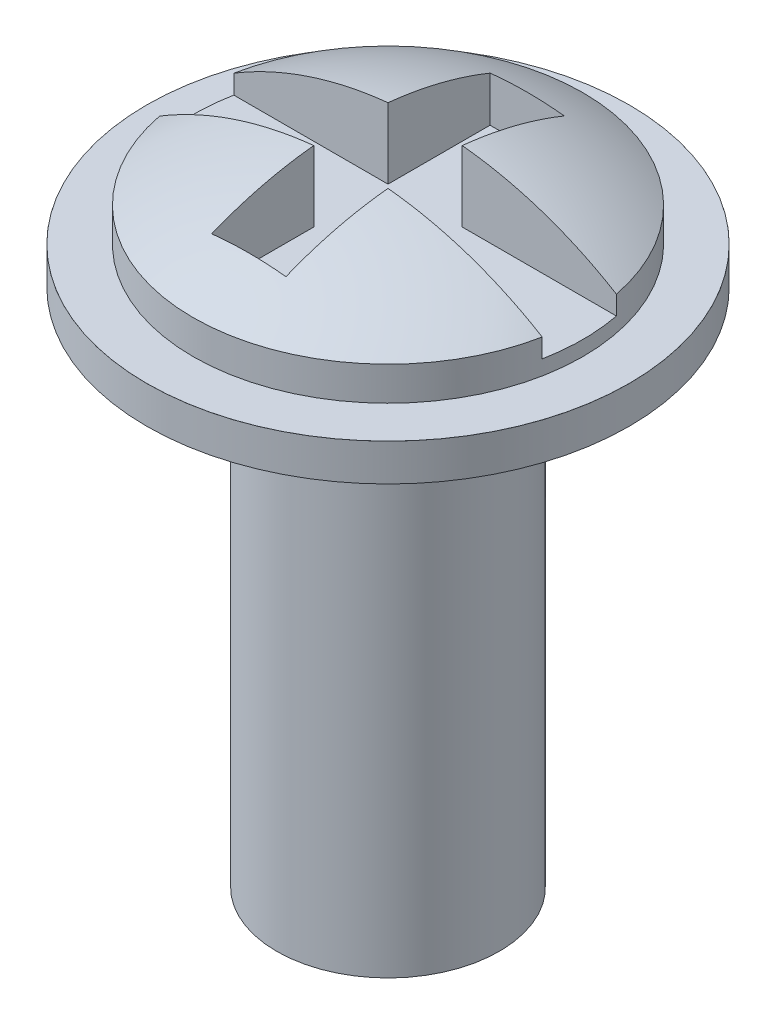
ISO-10303-21;
HEADER;
FILE_DESCRIPTION(('STEP AP214'),'2;1');
FILE_NAME('part.step','',(''),(''),'','','');
FILE_SCHEMA(('AUTOMOTIVE_DESIGN { 1 0 10303 214 1 1 1 1 }'));
ENDSEC;
DATA;
#1=APPLICATION_CONTEXT('core data for automotive mechanical design processes');
#2=APPLICATION_PROTOCOL_DEFINITION('international standard','automotive_design',2000,#1);
#3=PRODUCT_CONTEXT('',#1,'mechanical');
#4=PRODUCT('Part','Part','',(#3));
#5=PRODUCT_RELATED_PRODUCT_CATEGORY('part','',(#4));
#6=PRODUCT_DEFINITION_FORMATION('','',#4);
#7=PRODUCT_DEFINITION_CONTEXT('part definition',#1,'design');
#8=PRODUCT_DEFINITION('design','',#6,#7);
#9=PRODUCT_DEFINITION_SHAPE('','',#8);
#10=(LENGTH_UNIT() NAMED_UNIT(*) SI_UNIT(.MILLI.,.METRE.));
#11=(NAMED_UNIT(*) PLANE_ANGLE_UNIT() SI_UNIT($,.RADIAN.));
#12=(NAMED_UNIT(*) SI_UNIT($,.STERADIAN.) SOLID_ANGLE_UNIT());
#13=UNCERTAINTY_MEASURE_WITH_UNIT(LENGTH_MEASURE(1.E-05),#10,'distance_accuracy_value','');
#14=(GEOMETRIC_REPRESENTATION_CONTEXT(3) GLOBAL_UNCERTAINTY_ASSIGNED_CONTEXT((#13)) GLOBAL_UNIT_ASSIGNED_CONTEXT((#10,
#11,#12)) REPRESENTATION_CONTEXT('',''));
#15=CARTESIAN_POINT('',(0.,0.,0.));
#16=DIRECTION('',(0.,0.,1.));
#17=DIRECTION('',(1.,0.,0.));
#18=AXIS2_PLACEMENT_3D('',#15,#16,#17);
#19=CARTESIAN_POINT('',(0.,7.5,0.));
#20=DIRECTION('',(0.,-1.,0.));
#21=DIRECTION('',(0.,0.,-1.));
#22=AXIS2_PLACEMENT_3D('',#19,#20,#21);
#23=CYLINDRICAL_SURFACE('',#22,3.25);
#24=CARTESIAN_POINT('',(0.,7.,0.));
#25=DIRECTION('',(0.,1.,0.));
#26=DIRECTION('',(0.,0.,1.));
#27=AXIS2_PLACEMENT_3D('',#24,#25,#26);
#28=CIRCLE('',#27,3.25);
#29=CARTESIAN_POINT('',(0.,7.,3.25));
#30=VERTEX_POINT('',#29);
#31=EDGE_CURVE('E173',#30,#30,#28,.T.);
#32=ORIENTED_EDGE('',*,*,#31,.T.);
#33=EDGE_LOOP('',(#32));
#34=FACE_BOUND('',#33,.T.);
#35=CARTESIAN_POINT('',(0.,7.49967103839267,0.));
#36=DIRECTION('',(0.,-1.,0.));
#37=DIRECTION('',(0.,0.,-1.));
#38=AXIS2_PLACEMENT_3D('',#35,#36,#37);
#39=CIRCLE('',#38,3.25);
#40=CARTESIAN_POINT('',(0.,7.49967103839267,3.25));
#41=VERTEX_POINT('',#40);
#42=EDGE_CURVE('E222',#41,#41,#39,.F.);
#43=ORIENTED_EDGE('',*,*,#42,.F.);
#44=EDGE_LOOP('',(#43));
#45=FACE_BOUND('',#44,.T.);
#46=ADVANCED_FACE('F33',(#34,#45),#23,.T.);
#47=CARTESIAN_POINT('',(0.,7.,0.));
#48=DIRECTION('',(0.,-1.,0.));
#49=DIRECTION('',(0.,0.,-1.));
#50=AXIS2_PLACEMENT_3D('',#47,#48,#49);
#51=CYLINDRICAL_SURFACE('',#50,1.5);
#52=CARTESIAN_POINT('',(0.,7.,0.));
#53=DIRECTION('',(0.,1.,0.));
#54=DIRECTION('',(0.,0.,1.));
#55=AXIS2_PLACEMENT_3D('',#52,#53,#54);
#56=CIRCLE('',#55,1.5);
#57=CARTESIAN_POINT('',(0.,7.,1.5));
#58=VERTEX_POINT('',#57);
#59=EDGE_CURVE('E179',#58,#58,#56,.T.);
#60=ORIENTED_EDGE('',*,*,#59,.F.);
#61=EDGE_LOOP('',(#60));
#62=FACE_BOUND('',#61,.T.);
#63=CARTESIAN_POINT('',(0.,0.,0.));
#64=DIRECTION('',(0.,1.,0.));
#65=DIRECTION('',(0.,0.,1.));
#66=AXIS2_PLACEMENT_3D('',#63,#64,#65);
#67=CIRCLE('',#66,1.5);
#68=CARTESIAN_POINT('',(0.,0.,1.5));
#69=VERTEX_POINT('',#68);
#70=EDGE_CURVE('E176',#69,#69,#67,.T.);
#71=ORIENTED_EDGE('',*,*,#70,.T.);
#72=EDGE_LOOP('',(#71));
#73=FACE_BOUND('',#72,.T.);
#74=ADVANCED_FACE('F35',(#62,#73),#51,.T.);
#75=CARTESIAN_POINT('',(0.,0.,0.));
#76=DIRECTION('',(0.,1.,0.));
#77=DIRECTION('',(0.,0.,1.));
#78=AXIS2_PLACEMENT_3D('',#75,#76,#77);
#79=PLANE('',#78);
#80=ORIENTED_EDGE('',*,*,#70,.F.);
#81=EDGE_LOOP('',(#80));
#82=FACE_BOUND('',#81,.T.);
#83=ADVANCED_FACE('F282',(#82),#79,.F.);
#84=CARTESIAN_POINT('',(0.,7.,0.));
#85=DIRECTION('',(0.,1.,0.));
#86=DIRECTION('',(0.,0.,1.));
#87=AXIS2_PLACEMENT_3D('',#84,#85,#86);
#88=PLANE('',#87);
#89=ORIENTED_EDGE('',*,*,#31,.F.);
#90=EDGE_LOOP('',(#89));
#91=FACE_BOUND('',#90,.T.);
#92=ORIENTED_EDGE('',*,*,#59,.T.);
#93=EDGE_LOOP('',(#92));
#94=FACE_BOUND('',#93,.T.);
#95=ADVANCED_FACE('F286',(#91,#94),#88,.F.);
#96=CARTESIAN_POINT('',(0.,3.7,0.));
#97=DIRECTION('',(0.,-1.,0.));
#98=DIRECTION('',(0.,0.,1.));
#99=AXIS2_PLACEMENT_3D('',#96,#97,#98);
#100=SPHERICAL_SURFACE('',#99,5.);
#101=CARTESIAN_POINT('',(0.,7.5,0.));
#102=DIRECTION('',(0.,1.,0.));
#103=DIRECTION('',(0.,0.,1.));
#104=AXIS2_PLACEMENT_3D('',#101,#102,#103);
#105=CIRCLE('',#104,3.24961536185438);
#106=CARTESIAN_POINT('',(0.,7.5,3.24961536185438));
#107=VERTEX_POINT('',#106);
#108=EDGE_CURVE('E205',#107,#107,#105,.T.);
#109=CARTESIAN_POINT('',(0.,7.5,3.24961536185438));
#110=CARTESIAN_POINT('',(0.,7.49999657351938,3.24961936867516));
#111=CARTESIAN_POINT('',(0.,7.49999314703242,3.24962337549052));
#112=CARTESIAN_POINT('',(0.,7.49998629404583,3.24963138911041));
#113=CARTESIAN_POINT('',(0.,7.4999828675462,3.24963539591493));
#114=CARTESIAN_POINT('',(0.,7.49997601453426,3.24964340951313));
#115=CARTESIAN_POINT('',(0.,7.49997258802195,3.24964741630681));
#116=CARTESIAN_POINT('',(0.,7.49996573498466,3.24965542988334));
#117=CARTESIAN_POINT('',(0.,7.49996230845968,3.24965943666618));
#118=CARTESIAN_POINT('',(0.,7.49995545539704,3.24966745022103));
#119=CARTESIAN_POINT('',(0.,7.49995202885939,3.24967145699303));
#120=CARTESIAN_POINT('',(0.,7.4999451757714,3.2496794705262));
#121=CARTESIAN_POINT('',(0.,7.49994174922107,3.24968347728737));
#122=CARTESIAN_POINT('',(0.,7.49993489610773,3.24969149079886));
#123=CARTESIAN_POINT('',(0.,7.49993146954473,3.24969549754918));
#124=CARTESIAN_POINT('',(0.,7.49992461640604,3.249703511039));
#125=CARTESIAN_POINT('',(0.,7.49992118983036,3.24970751777848));
#126=CARTESIAN_POINT('',(0.,7.49991433666633,3.24971553124662));
#127=CARTESIAN_POINT('',(0.,7.49991091007797,3.24971953797526));
#128=CARTESIAN_POINT('',(0.,7.49990405688859,3.24972755142172));
#129=CARTESIAN_POINT('',(0.,7.49990063028756,3.24973155813953));
#130=CARTESIAN_POINT('',(0.,7.49989377707283,3.24973957156431));
#131=CARTESIAN_POINT('',(0.,7.49989035045913,3.24974357827127));
#132=CARTESIAN_POINT('',(0.,7.49988349721905,3.24975159167437));
#133=CARTESIAN_POINT('',(0.,7.49988007059267,3.2497555983705));
#134=CARTESIAN_POINT('',(0.,7.49987321732724,3.24976361175192));
#135=CARTESIAN_POINT('',(0.,7.49986979068819,3.24976761843721));
#136=CARTESIAN_POINT('',(0.,7.49986293739742,3.24977563179695));
#137=CARTESIAN_POINT('',(0.,7.49985951074569,3.2497796384714));
#138=CARTESIAN_POINT('',(0.,7.49985265742956,3.24978765180946));
#139=CARTESIAN_POINT('',(0.,7.49984923076516,3.24979165847308));
#140=CARTESIAN_POINT('',(0.,7.49984237742369,3.24979967178946));
#141=CARTESIAN_POINT('',(0.,7.49983895074662,3.24980367844223));
#142=CARTESIAN_POINT('',(0.,7.49983209737979,3.24981169173693));
#143=CARTESIAN_POINT('',(0.,7.49982867069004,3.24981569837887));
#144=CARTESIAN_POINT('',(0.,7.49982181729788,3.24982371165189));
#145=CARTESIAN_POINT('',(0.,7.49981839059545,3.24982771828298));
#146=CARTESIAN_POINT('',(0.,7.49981153717793,3.24983573153433));
#147=CARTESIAN_POINT('',(0.,7.49980811046284,3.24983973815458));
#148=CARTESIAN_POINT('',(0.,7.49980125701997,3.24984775138425));
#149=CARTESIAN_POINT('',(0.,7.4997978302922,3.24985175799366));
#150=CARTESIAN_POINT('',(0.,7.49979097682398,3.24985977120165));
#151=CARTESIAN_POINT('',(0.,7.49978755008354,3.24986377780022));
#152=CARTESIAN_POINT('',(0.,7.49978069658998,3.24987179098653));
#153=CARTESIAN_POINT('',(0.,7.49977726983686,3.24987579757426));
#154=CARTESIAN_POINT('',(0.,7.49977041631795,3.24988381073889));
#155=CARTESIAN_POINT('',(0.,7.49976698955216,3.24988781731578));
#156=CARTESIAN_POINT('',(0.,7.4997601360079,3.24989583045873));
#157=CARTESIAN_POINT('',(0.,7.49975670922943,3.24989983702478));
#158=CARTESIAN_POINT('',(0.,7.49974985565982,3.24990785014605));
#159=CARTESIAN_POINT('',(0.,7.49974642886868,3.24991185670127));
#160=CARTESIAN_POINT('',(0.,7.49973957527373,3.24991986980086));
#161=CARTESIAN_POINT('',(0.,7.49973614846992,3.24992387634523));
#162=CARTESIAN_POINT('',(0.,7.49972929484961,3.24993188942314));
#163=CARTESIAN_POINT('',(0.,7.49972586803313,3.24993589595667));
#164=CARTESIAN_POINT('',(0.,7.49971901438748,3.2499439090129));
#165=CARTESIAN_POINT('',(0.,7.49971558755831,3.2499479155356));
#166=CARTESIAN_POINT('',(0.,7.49970873388732,3.24995592857014));
#167=CARTESIAN_POINT('',(0.,7.49970530704548,3.249959935082));
#168=CARTESIAN_POINT('',(0.,7.49969845334914,3.24996794809487));
#169=CARTESIAN_POINT('',(0.,7.49969502649463,3.24997195459588));
#170=CARTESIAN_POINT('',(0.,7.49968817277294,3.24997996758707));
#171=CARTESIAN_POINT('',(0.,7.49968474590576,3.24998397407724));
#172=CARTESIAN_POINT('',(0.,7.49967789215872,3.24999198704675));
#173=CARTESIAN_POINT('',(0.,7.49967446527886,3.24999599352609));
#174=CARTESIAN_POINT('',(0.,7.49967103839267,3.25));
#175=B_SPLINE_CURVE_WITH_KNOTS('',3,(#109,#110,#111,#112,#113,#114,#115,#116,#117,#118,#119,
#120,#121,#122,#123,#124,#125,#126,#127,#128,#129,#130,#131,#132,#133,#134,#135,#136,#137,#138,
#139,#140,#141,#142,#143,#144,#145,#146,#147,#148,#149,#150,#151,#152,#153,#154,#155,#156,#157,
#158,#159,#160,#161,#162,#163,#164,#165,#166,#167,#168,#169,#170,#171,#172,#173,#174),
.UNSPECIFIED.,.F.,.F.,(4,2,2,2,2,2,2,2,2,2,2,2,2,2,2,2,2,2,2,2,2,2,2,2,2,2,2,2,2,2,2,2,4),(0.,
1.58163978147349E-05,3.16327956290275E-05,4.74491934427065E-05,6.32655912573873E-05,
7.90819890721005E-05,9.4898386886675E-05,0.000110714784701269,0.000126531182514818,
0.00014234758033016,0.000158163978144209,0.000173980375958581,0.000189796773773435,
0.000205613171587141,0.000221429569401316,0.000237245967216446,0.000253062365030575,
0.000268878762844519,0.000284695160658905,0.000300511558473657,0.00031632795628771,
0.000332144354102446,0.00034796075191713,0.000363777149731027,0.000379593547545985,
0.000395409945360472,0.000411226343173754,0.000427042740988242,0.000442859138803628,
0.000458675536617624,0.000474491934431844,0.000490308332246309,0.00050612473006089),.UNSPECIFIED.);
#176=EDGE_CURVE('BSEAM271',#107,#41,#175,.T.);
#177=ORIENTED_EDGE('',*,*,#108,.F.);
#178=ORIENTED_EDGE('',*,*,#42,.T.);
#179=ORIENTED_EDGE('',*,*,#176,.T.);
#180=ORIENTED_EDGE('',*,*,#176,.F.);
#181=EDGE_LOOP('',(#177,#179,#178,#180));
#182=FACE_BOUND('',#181,.T.);
#183=ADVANCED_FACE('F271',(#182),#100,.T.);
#184=CARTESIAN_POINT('',(-3.50234861591695,7.7,0.5));
#185=DIRECTION('',(0.,1.,0.));
#186=DIRECTION('',(0.,0.,1.));
#187=AXIS2_PLACEMENT_3D('',#184,#185,#186);
#188=PLANE('',#187);
#189=DIRECTION('',(-1.,0.,0.));
#190=VECTOR('',#189,1.);
#191=CARTESIAN_POINT('',(-3.50234861591695,7.7,-0.5));
#192=LINE('',#191,#190);
#193=CARTESIAN_POINT('',(2.57694101601104,7.7,-0.5));
#194=VERTEX_POINT('',#193);
#195=CARTESIAN_POINT('',(0.5,7.7,-0.5));
#196=VERTEX_POINT('',#195);
#197=EDGE_CURVE('E157',#194,#196,#192,.T.);
#198=ORIENTED_EDGE('',*,*,#197,.T.);
#199=DIRECTION('',(0.,0.,-1.));
#200=VECTOR('',#199,1.);
#201=CARTESIAN_POINT('',(0.5,7.7,-1.875));
#202=LINE('',#201,#200);
#203=CARTESIAN_POINT('',(0.5,7.7,-1.875));
#204=VERTEX_POINT('',#203);
#205=EDGE_CURVE('E237',#196,#204,#202,.T.);
#206=ORIENTED_EDGE('',*,*,#205,.T.);
#207=DIRECTION('',(-1.,0.,0.));
#208=VECTOR('',#207,1.);
#209=CARTESIAN_POINT('',(-0.5,7.7,-1.875));
#210=LINE('',#209,#208);
#211=CARTESIAN_POINT('',(-0.5,7.7,-1.875));
#212=VERTEX_POINT('',#211);
#213=EDGE_CURVE('E136',#204,#212,#210,.T.);
#214=ORIENTED_EDGE('',*,*,#213,.T.);
#215=DIRECTION('',(0.,0.,1.));
#216=VECTOR('',#215,1.);
#217=CARTESIAN_POINT('',(-0.5,7.7,-1.875));
#218=LINE('',#217,#216);
#219=CARTESIAN_POINT('',(-0.5,7.7,-0.5));
#220=VERTEX_POINT('',#219);
#221=EDGE_CURVE('E204',#212,#220,#218,.T.);
#222=ORIENTED_EDGE('',*,*,#221,.T.);
#223=CARTESIAN_POINT('',(-2.57694101601104,7.7,-0.5));
#224=VERTEX_POINT('',#223);
#225=EDGE_CURVE('E156',#220,#224,#192,.T.);
#226=ORIENTED_EDGE('',*,*,#225,.T.);
#227=CARTESIAN_POINT('',(0.,7.7,0.));
#228=DIRECTION('',(0.,1.,0.));
#229=DIRECTION('',(0.,0.,1.));
#230=AXIS2_PLACEMENT_3D('',#227,#228,#229);
#231=CIRCLE('',#230,2.625);
#232=CARTESIAN_POINT('',(-2.57694101601104,7.7,0.5));
#233=VERTEX_POINT('',#232);
#234=EDGE_CURVE('E182',#224,#233,#231,.T.);
#235=ORIENTED_EDGE('',*,*,#234,.T.);
#236=DIRECTION('',(1.,0.,0.));
#237=VECTOR('',#236,1.);
#238=CARTESIAN_POINT('',(-3.50234861591695,7.7,0.5));
#239=LINE('',#238,#237);
#240=CARTESIAN_POINT('',(-0.499999999999999,7.7,0.5));
#241=VERTEX_POINT('',#240);
#242=EDGE_CURVE('E153',#233,#241,#239,.T.);
#243=ORIENTED_EDGE('',*,*,#242,.T.);
#244=CARTESIAN_POINT('',(-0.499999999999999,7.7,1.875));
#245=VERTEX_POINT('',#244);
#246=EDGE_CURVE('E199',#241,#245,#218,.T.);
#247=ORIENTED_EDGE('',*,*,#246,.T.);
#248=DIRECTION('',(1.,0.,0.));
#249=VECTOR('',#248,1.);
#250=CARTESIAN_POINT('',(-0.499999999999999,7.7,1.875));
#251=LINE('',#250,#249);
#252=CARTESIAN_POINT('',(0.499999999999999,7.7,1.875));
#253=VERTEX_POINT('',#252);
#254=EDGE_CURVE('E256',#245,#253,#251,.T.);
#255=ORIENTED_EDGE('',*,*,#254,.T.);
#256=CARTESIAN_POINT('',(0.5,7.7,0.5));
#257=VERTEX_POINT('',#256);
#258=EDGE_CURVE('E240',#253,#257,#202,.T.);
#259=ORIENTED_EDGE('',*,*,#258,.T.);
#260=CARTESIAN_POINT('',(2.57694101601104,7.7,0.5));
#261=VERTEX_POINT('',#260);
#262=EDGE_CURVE('E152',#257,#261,#239,.T.);
#263=ORIENTED_EDGE('',*,*,#262,.T.);
#264=EDGE_CURVE('E185',#261,#194,#231,.T.);
#265=ORIENTED_EDGE('',*,*,#264,.T.);
#266=EDGE_LOOP('',(#198,#206,#214,#222,#226,#235,#243,#247,#255,#259,#263,#265));
#267=FACE_BOUND('',#266,.T.);
#268=ADVANCED_FACE('F207',(#267),#188,.T.);
#269=CARTESIAN_POINT('',(-0.499999999999999,7.7,1.875));
#270=DIRECTION('',(0.,0.,1.));
#271=DIRECTION('',(1.,0.,0.));
#272=AXIS2_PLACEMENT_3D('',#269,#270,#271);
#273=PLANE('',#272);
#274=CARTESIAN_POINT('',(0.,3.7,1.875));
#275=DIRECTION('',(0.,0.,1.));
#276=DIRECTION('',(1.,0.,0.));
#277=AXIS2_PLACEMENT_3D('',#274,#275,#276);
#278=CIRCLE('',#277,4.63512405443479);
#279=CARTESIAN_POINT('',(0.499999999999999,8.30807714779169,1.875));
#280=VERTEX_POINT('',#279);
#281=CARTESIAN_POINT('',(-0.499999999999999,8.30807714779169,1.875));
#282=VERTEX_POINT('',#281);
#283=EDGE_CURVE('E230',#280,#282,#278,.T.);
#284=ORIENTED_EDGE('',*,*,#283,.F.);
#285=DIRECTION('',(0.,1.,0.));
#286=VECTOR('',#285,1.);
#287=CARTESIAN_POINT('',(0.499999999999999,7.7,1.875));
#288=LINE('',#287,#286);
#289=EDGE_CURVE('E138',#253,#280,#288,.T.);
#290=ORIENTED_EDGE('',*,*,#289,.F.);
#291=ORIENTED_EDGE('',*,*,#254,.F.);
#292=DIRECTION('',(0.,1.,0.));
#293=VECTOR('',#292,1.);
#294=CARTESIAN_POINT('',(-0.499999999999999,7.7,1.875));
#295=LINE('',#294,#293);
#296=EDGE_CURVE('E142',#245,#282,#295,.T.);
#297=ORIENTED_EDGE('',*,*,#296,.T.);
#298=EDGE_LOOP('',(#284,#290,#291,#297));
#299=FACE_BOUND('',#298,.T.);
#300=ADVANCED_FACE('F306',(#299),#273,.F.);
#301=CARTESIAN_POINT('',(-0.5,7.7,-1.875));
#302=DIRECTION('',(-1.,0.,0.));
#303=DIRECTION('',(0.,0.,1.));
#304=AXIS2_PLACEMENT_3D('',#301,#302,#303);
#305=PLANE('',#304);
#306=CARTESIAN_POINT('',(-0.5,3.7,0.));
#307=DIRECTION('',(-1.,0.,0.));
#308=DIRECTION('',(0.,0.,1.));
#309=AXIS2_PLACEMENT_3D('',#306,#307,#308);
#310=CIRCLE('',#309,4.9749371855331);
#311=CARTESIAN_POINT('',(-0.499999999999999,8.64974746830583,0.5));
#312=VERTEX_POINT('',#311);
#313=EDGE_CURVE('E247',#282,#312,#310,.T.);
#314=ORIENTED_EDGE('',*,*,#313,.F.);
#315=ORIENTED_EDGE('',*,*,#296,.F.);
#316=ORIENTED_EDGE('',*,*,#246,.F.);
#317=DIRECTION('',(0.,-1.,0.));
#318=VECTOR('',#317,1.);
#319=CARTESIAN_POINT('',(-0.5,7.7,0.5));
#320=LINE('',#319,#318);
#321=EDGE_CURVE('E41',#312,#241,#320,.T.);
#322=ORIENTED_EDGE('',*,*,#321,.F.);
#323=EDGE_LOOP('',(#314,#315,#316,#322));
#324=FACE_BOUND('',#323,.T.);
#325=ADVANCED_FACE('F200',(#324),#305,.F.);
#326=CARTESIAN_POINT('',(0.5,7.7,-1.875));
#327=DIRECTION('',(1.,0.,0.));
#328=DIRECTION('',(0.,0.,-1.));
#329=AXIS2_PLACEMENT_3D('',#326,#327,#328);
#330=PLANE('',#329);
#331=CARTESIAN_POINT('',(0.5,3.7,0.));
#332=DIRECTION('',(1.,0.,0.));
#333=DIRECTION('',(0.,0.,-1.));
#334=AXIS2_PLACEMENT_3D('',#331,#332,#333);
#335=CIRCLE('',#334,4.9749371855331);
#336=CARTESIAN_POINT('',(0.5,8.64974746830583,0.5));
#337=VERTEX_POINT('',#336);
#338=EDGE_CURVE('E48',#337,#280,#335,.T.);
#339=ORIENTED_EDGE('',*,*,#338,.F.);
#340=DIRECTION('',(0.,1.,0.));
#341=VECTOR('',#340,1.);
#342=CARTESIAN_POINT('',(0.5,7.7,0.5));
#343=LINE('',#342,#341);
#344=EDGE_CURVE('E186',#257,#337,#343,.T.);
#345=ORIENTED_EDGE('',*,*,#344,.F.);
#346=ORIENTED_EDGE('',*,*,#258,.F.);
#347=ORIENTED_EDGE('',*,*,#289,.T.);
#348=EDGE_LOOP('',(#339,#345,#346,#347));
#349=FACE_BOUND('',#348,.T.);
#350=ADVANCED_FACE('F246',(#349),#330,.F.);
#351=CARTESIAN_POINT('',(-3.50234861591695,7.7,0.5));
#352=DIRECTION('',(0.,0.,1.));
#353=DIRECTION('',(1.,0.,0.));
#354=AXIS2_PLACEMENT_3D('',#351,#352,#353);
#355=PLANE('',#354);
#356=CARTESIAN_POINT('',(0.,3.7,0.5));
#357=DIRECTION('',(0.,0.,1.));
#358=DIRECTION('',(1.,0.,0.));
#359=AXIS2_PLACEMENT_3D('',#356,#357,#358);
#360=CIRCLE('',#359,4.9749371855331);
#361=CARTESIAN_POINT('',(2.57694101601104,7.9555111326373,0.5));
#362=VERTEX_POINT('',#361);
#363=EDGE_CURVE('E219',#362,#337,#360,.T.);
#364=ORIENTED_EDGE('',*,*,#363,.F.);
#365=DIRECTION('',(0.,-1.,0.));
#366=VECTOR('',#365,1.);
#367=CARTESIAN_POINT('',(2.57694101601104,8.7,0.5));
#368=LINE('',#367,#366);
#369=EDGE_CURVE('E160',#261,#362,#368,.F.);
#370=ORIENTED_EDGE('',*,*,#369,.F.);
#371=ORIENTED_EDGE('',*,*,#262,.F.);
#372=ORIENTED_EDGE('',*,*,#344,.T.);
#373=EDGE_LOOP('',(#364,#370,#371,#372));
#374=FACE_BOUND('',#373,.T.);
#375=ADVANCED_FACE('F243',(#374),#355,.F.);
#376=CARTESIAN_POINT('',(-0.5,7.7,-1.875));
#377=DIRECTION('',(0.,0.,-1.));
#378=DIRECTION('',(-1.,0.,0.));
#379=AXIS2_PLACEMENT_3D('',#376,#377,#378);
#380=PLANE('',#379);
#381=CARTESIAN_POINT('',(0.,3.7,-1.875));
#382=DIRECTION('',(0.,0.,-1.));
#383=DIRECTION('',(-1.,0.,0.));
#384=AXIS2_PLACEMENT_3D('',#381,#382,#383);
#385=CIRCLE('',#384,4.63512405443479);
#386=CARTESIAN_POINT('',(-0.5,8.30807714779169,-1.875));
#387=VERTEX_POINT('',#386);
#388=CARTESIAN_POINT('',(0.5,8.30807714779169,-1.875));
#389=VERTEX_POINT('',#388);
#390=EDGE_CURVE('E11',#387,#389,#385,.T.);
#391=ORIENTED_EDGE('',*,*,#390,.F.);
#392=DIRECTION('',(0.,1.,0.));
#393=VECTOR('',#392,1.);
#394=CARTESIAN_POINT('',(-0.5,7.7,-1.875));
#395=LINE('',#394,#393);
#396=EDGE_CURVE('E137',#212,#387,#395,.T.);
#397=ORIENTED_EDGE('',*,*,#396,.F.);
#398=ORIENTED_EDGE('',*,*,#213,.F.);
#399=DIRECTION('',(0.,1.,0.));
#400=VECTOR('',#399,1.);
#401=CARTESIAN_POINT('',(0.5,7.7,-1.875));
#402=LINE('',#401,#400);
#403=EDGE_CURVE('E130',#204,#389,#402,.T.);
#404=ORIENTED_EDGE('',*,*,#403,.T.);
#405=EDGE_LOOP('',(#391,#397,#398,#404));
#406=FACE_BOUND('',#405,.T.);
#407=ADVANCED_FACE('F134',(#406),#380,.F.);
#408=CARTESIAN_POINT('',(0.5,3.7,0.));
#409=DIRECTION('',(1.,0.,0.));
#410=DIRECTION('',(0.,0.,-1.));
#411=AXIS2_PLACEMENT_3D('',#408,#409,#410);
#412=CIRCLE('',#411,4.9749371855331);
#413=CARTESIAN_POINT('',(0.5,8.64974746830583,-0.5));
#414=VERTEX_POINT('',#413);
#415=EDGE_CURVE('E120',#389,#414,#412,.T.);
#416=ORIENTED_EDGE('',*,*,#415,.F.);
#417=ORIENTED_EDGE('',*,*,#403,.F.);
#418=ORIENTED_EDGE('',*,*,#205,.F.);
#419=DIRECTION('',(0.,-1.,0.));
#420=VECTOR('',#419,1.);
#421=CARTESIAN_POINT('',(0.5,7.7,-0.5));
#422=LINE('',#421,#420);
#423=EDGE_CURVE('E132',#414,#196,#422,.T.);
#424=ORIENTED_EDGE('',*,*,#423,.F.);
#425=EDGE_LOOP('',(#416,#417,#418,#424));
#426=FACE_BOUND('',#425,.T.);
#427=ADVANCED_FACE('F128',(#426),#330,.F.);
#428=CARTESIAN_POINT('',(-0.5,3.7,0.));
#429=DIRECTION('',(-1.,0.,0.));
#430=DIRECTION('',(0.,0.,1.));
#431=AXIS2_PLACEMENT_3D('',#428,#429,#430);
#432=CIRCLE('',#431,4.9749371855331);
#433=CARTESIAN_POINT('',(-0.5,8.64974746830583,-0.5));
#434=VERTEX_POINT('',#433);
#435=EDGE_CURVE('E55',#434,#387,#432,.T.);
#436=ORIENTED_EDGE('',*,*,#435,.F.);
#437=DIRECTION('',(0.,1.,0.));
#438=VECTOR('',#437,1.);
#439=CARTESIAN_POINT('',(-0.5,7.7,-0.5));
#440=LINE('',#439,#438);
#441=EDGE_CURVE('E149',#220,#434,#440,.T.);
#442=ORIENTED_EDGE('',*,*,#441,.F.);
#443=ORIENTED_EDGE('',*,*,#221,.F.);
#444=ORIENTED_EDGE('',*,*,#396,.T.);
#445=EDGE_LOOP('',(#436,#442,#443,#444));
#446=FACE_BOUND('',#445,.T.);
#447=ADVANCED_FACE('F261',(#446),#305,.F.);
#448=CARTESIAN_POINT('',(-3.50234861591695,7.7,-0.5));
#449=DIRECTION('',(0.,0.,-1.));
#450=DIRECTION('',(-1.,0.,0.));
#451=AXIS2_PLACEMENT_3D('',#448,#449,#450);
#452=PLANE('',#451);
#453=CARTESIAN_POINT('',(0.,3.7,-0.5));
#454=DIRECTION('',(0.,0.,-1.));
#455=DIRECTION('',(-1.,0.,0.));
#456=AXIS2_PLACEMENT_3D('',#453,#454,#455);
#457=CIRCLE('',#456,4.9749371855331);
#458=CARTESIAN_POINT('',(2.57694101601104,7.9555111326373,-0.5));
#459=VERTEX_POINT('',#458);
#460=EDGE_CURVE('E228',#414,#459,#457,.T.);
#461=ORIENTED_EDGE('',*,*,#460,.F.);
#462=ORIENTED_EDGE('',*,*,#423,.T.);
#463=ORIENTED_EDGE('',*,*,#197,.F.);
#464=DIRECTION('',(0.,-1.,0.));
#465=VECTOR('',#464,1.);
#466=CARTESIAN_POINT('',(2.57694101601104,8.7,-0.5));
#467=LINE('',#466,#465);
#468=EDGE_CURVE('E168',#459,#194,#467,.T.);
#469=ORIENTED_EDGE('',*,*,#468,.F.);
#470=EDGE_LOOP('',(#461,#462,#463,#469));
#471=FACE_BOUND('',#470,.T.);
#472=ADVANCED_FACE('F236',(#471),#452,.F.);
#473=CARTESIAN_POINT('',(0.,8.7,0.));
#474=DIRECTION('',(0.,-1.,0.));
#475=DIRECTION('',(0.,0.,-1.));
#476=AXIS2_PLACEMENT_3D('',#473,#474,#475);
#477=CYLINDRICAL_SURFACE('',#476,2.625);
#478=CARTESIAN_POINT('',(0.,7.5,0.));
#479=DIRECTION('',(0.,1.,0.));
#480=DIRECTION('',(0.,0.,1.));
#481=AXIS2_PLACEMENT_3D('',#478,#479,#480);
#482=CIRCLE('',#481,2.625);
#483=CARTESIAN_POINT('',(0.,7.5,2.625));
#484=VERTEX_POINT('',#483);
#485=EDGE_CURVE('E170',#484,#484,#482,.T.);
#486=ORIENTED_EDGE('',*,*,#485,.T.);
#487=EDGE_LOOP('',(#486));
#488=FACE_BOUND('',#487,.T.);
#489=CARTESIAN_POINT('',(0.,7.9555111326373,0.));
#490=DIRECTION('',(0.,-1.,0.));
#491=DIRECTION('',(0.,0.,-1.));
#492=AXIS2_PLACEMENT_3D('',#489,#490,#491);
#493=CIRCLE('',#492,2.625);
#494=CARTESIAN_POINT('',(-2.57694101601104,7.9555111326373,0.5));
#495=VERTEX_POINT('',#494);
#496=EDGE_CURVE('E215',#495,#362,#493,.F.);
#497=ORIENTED_EDGE('',*,*,#496,.F.);
#498=DIRECTION('',(0.,-1.,0.));
#499=VECTOR('',#498,1.);
#500=CARTESIAN_POINT('',(-2.57694101601104,8.7,0.5));
#501=LINE('',#500,#499);
#502=EDGE_CURVE('E163',#495,#233,#501,.T.);
#503=ORIENTED_EDGE('',*,*,#502,.T.);
#504=ORIENTED_EDGE('',*,*,#234,.F.);
#505=DIRECTION('',(0.,-1.,0.));
#506=VECTOR('',#505,1.);
#507=CARTESIAN_POINT('',(-2.57694101601104,8.7,-0.5));
#508=LINE('',#507,#506);
#509=CARTESIAN_POINT('',(-2.57694101601104,7.9555111326373,-0.5));
#510=VERTEX_POINT('',#509);
#511=EDGE_CURVE('E165',#224,#510,#508,.F.);
#512=ORIENTED_EDGE('',*,*,#511,.T.);
#513=EDGE_CURVE('E221',#459,#510,#493,.F.);
#514=ORIENTED_EDGE('',*,*,#513,.F.);
#515=ORIENTED_EDGE('',*,*,#468,.T.);
#516=ORIENTED_EDGE('',*,*,#264,.F.);
#517=ORIENTED_EDGE('',*,*,#369,.T.);
#518=EDGE_LOOP('',(#497,#503,#504,#512,#514,#515,#516,#517));
#519=FACE_BOUND('',#518,.T.);
#520=ADVANCED_FACE('F213',(#488,#519),#477,.T.);
#521=CARTESIAN_POINT('',(0.,7.5,0.));
#522=DIRECTION('',(0.,1.,0.));
#523=DIRECTION('',(0.,0.,1.));
#524=AXIS2_PLACEMENT_3D('',#521,#522,#523);
#525=PLANE('',#524);
#526=ORIENTED_EDGE('',*,*,#485,.F.);
#527=EDGE_LOOP('',(#526));
#528=FACE_BOUND('',#527,.T.);
#529=ORIENTED_EDGE('',*,*,#108,.T.);
#530=EDGE_LOOP('',(#529));
#531=FACE_BOUND('',#530,.T.);
#532=ADVANCED_FACE('F272',(#528,#531),#525,.T.);
#533=CARTESIAN_POINT('',(0.,3.7,0.5));
#534=DIRECTION('',(0.,0.,1.));
#535=DIRECTION('',(1.,0.,0.));
#536=AXIS2_PLACEMENT_3D('',#533,#534,#535);
#537=CIRCLE('',#536,4.9749371855331);
#538=EDGE_CURVE('E195',#312,#495,#537,.T.);
#539=ORIENTED_EDGE('',*,*,#538,.F.);
#540=ORIENTED_EDGE('',*,*,#321,.T.);
#541=ORIENTED_EDGE('',*,*,#242,.F.);
#542=ORIENTED_EDGE('',*,*,#502,.F.);
#543=EDGE_LOOP('',(#539,#540,#541,#542));
#544=FACE_BOUND('',#543,.T.);
#545=ADVANCED_FACE('F193',(#544),#355,.F.);
#546=CARTESIAN_POINT('',(0.,3.7,-0.5));
#547=DIRECTION('',(0.,0.,-1.));
#548=DIRECTION('',(-1.,0.,0.));
#549=AXIS2_PLACEMENT_3D('',#546,#547,#548);
#550=CIRCLE('',#549,4.9749371855331);
#551=EDGE_CURVE('E227',#510,#434,#550,.T.);
#552=ORIENTED_EDGE('',*,*,#551,.F.);
#553=ORIENTED_EDGE('',*,*,#511,.F.);
#554=ORIENTED_EDGE('',*,*,#225,.F.);
#555=ORIENTED_EDGE('',*,*,#441,.T.);
#556=EDGE_LOOP('',(#552,#553,#554,#555));
#557=FACE_BOUND('',#556,.T.);
#558=ADVANCED_FACE('F263',(#557),#452,.F.);
#559=ORIENTED_EDGE('',*,*,#551,.T.);
#560=ORIENTED_EDGE('',*,*,#435,.T.);
#561=ORIENTED_EDGE('',*,*,#390,.T.);
#562=ORIENTED_EDGE('',*,*,#415,.T.);
#563=ORIENTED_EDGE('',*,*,#460,.T.);
#564=ORIENTED_EDGE('',*,*,#513,.T.);
#565=EDGE_LOOP('',(#559,#560,#561,#562,#563,#564));
#566=FACE_BOUND('',#565,.T.);
#567=ADVANCED_FACE('F119',(#566),#100,.T.);
#568=ORIENTED_EDGE('',*,*,#538,.T.);
#569=ORIENTED_EDGE('',*,*,#496,.T.);
#570=ORIENTED_EDGE('',*,*,#363,.T.);
#571=ORIENTED_EDGE('',*,*,#338,.T.);
#572=ORIENTED_EDGE('',*,*,#283,.T.);
#573=ORIENTED_EDGE('',*,*,#313,.T.);
#574=EDGE_LOOP('',(#568,#569,#570,#571,#572,#573));
#575=FACE_BOUND('',#574,.T.);
#576=ADVANCED_FACE('F244',(#575),#100,.T.);
#577=CLOSED_SHELL('',(#46,#74,#83,#95,#183,#268,#300,#325,#350,#375,#407,#427,#447,#472,#520,
#532,#545,#558,#567,#576));
#578=MANIFOLD_SOLID_BREP('B2',#577);
#579=ADVANCED_BREP_SHAPE_REPRESENTATION('',(#18,#578),#14);
#580=SHAPE_DEFINITION_REPRESENTATION(#9,#579);
ENDSEC;
END-ISO-10303-21;
